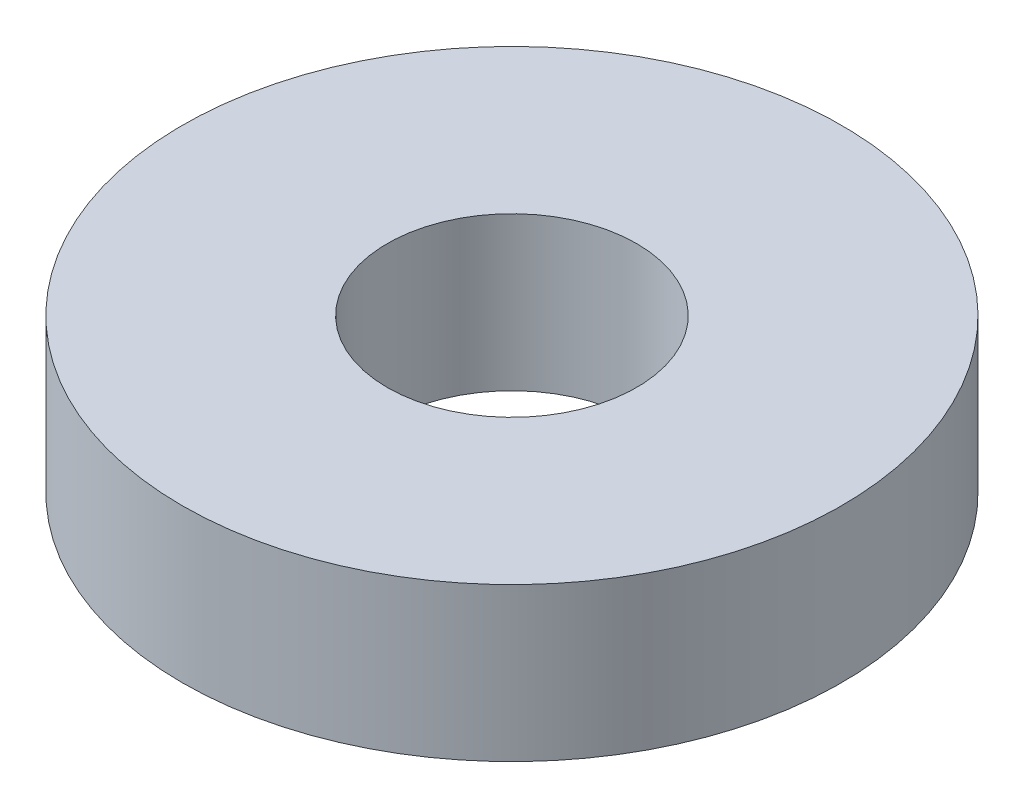
ISO-10303-21;
HEADER;
FILE_DESCRIPTION(('STEP AP214'),'2;1');
FILE_NAME('part.step','',(''),(''),'','','');
FILE_SCHEMA(('AUTOMOTIVE_DESIGN { 1 0 10303 214 1 1 1 1 }'));
ENDSEC;
DATA;
#1=APPLICATION_CONTEXT('core data for automotive mechanical design processes');
#2=APPLICATION_PROTOCOL_DEFINITION('international standard','automotive_design',2000,#1);
#3=PRODUCT_CONTEXT('',#1,'mechanical');
#4=PRODUCT('Part','Part','',(#3));
#5=PRODUCT_RELATED_PRODUCT_CATEGORY('part','',(#4));
#6=PRODUCT_DEFINITION_FORMATION('','',#4);
#7=PRODUCT_DEFINITION_CONTEXT('part definition',#1,'design');
#8=PRODUCT_DEFINITION('design','',#6,#7);
#9=PRODUCT_DEFINITION_SHAPE('','',#8);
#10=(LENGTH_UNIT() NAMED_UNIT(*) SI_UNIT(.MILLI.,.METRE.));
#11=(NAMED_UNIT(*) PLANE_ANGLE_UNIT() SI_UNIT($,.RADIAN.));
#12=(NAMED_UNIT(*) SI_UNIT($,.STERADIAN.) SOLID_ANGLE_UNIT());
#13=UNCERTAINTY_MEASURE_WITH_UNIT(LENGTH_MEASURE(1.E-05),#10,'distance_accuracy_value','');
#14=(GEOMETRIC_REPRESENTATION_CONTEXT(3) GLOBAL_UNCERTAINTY_ASSIGNED_CONTEXT((#13)) GLOBAL_UNIT_ASSIGNED_CONTEXT((#10,
#11,#12)) REPRESENTATION_CONTEXT('',''));
#15=CARTESIAN_POINT('',(0.,0.,0.));
#16=DIRECTION('',(0.,0.,1.));
#17=DIRECTION('',(1.,0.,0.));
#18=AXIS2_PLACEMENT_3D('',#15,#16,#17);
#19=CARTESIAN_POINT('',(0.,15.,0.));
#20=DIRECTION('',(0.,1.,0.));
#21=DIRECTION('',(0.,0.,1.));
#22=AXIS2_PLACEMENT_3D('',#19,#20,#21);
#23=PLANE('',#22);
#24=CARTESIAN_POINT('',(0.,15.,0.));
#25=DIRECTION('',(0.,1.,0.));
#26=DIRECTION('',(0.,0.,1.));
#27=AXIS2_PLACEMENT_3D('',#24,#25,#26);
#28=CIRCLE('',#27,32.2427292201506);
#29=CARTESIAN_POINT('',(0.,15.,32.2427292201506));
#30=VERTEX_POINT('',#29);
#31=EDGE_CURVE('E10',#30,#30,#28,.T.);
#32=ORIENTED_EDGE('',*,*,#31,.T.);
#33=EDGE_LOOP('',(#32));
#34=FACE_BOUND('',#33,.T.);
#35=CARTESIAN_POINT('',(0.,15.,0.));
#36=DIRECTION('',(0.,1.,0.));
#37=DIRECTION('',(0.,0.,1.));
#38=AXIS2_PLACEMENT_3D('',#35,#36,#37);
#39=CIRCLE('',#38,12.2);
#40=CARTESIAN_POINT('',(0.,15.,12.2));
#41=VERTEX_POINT('',#40);
#42=EDGE_CURVE('E48',#41,#41,#39,.T.);
#43=ORIENTED_EDGE('',*,*,#42,.F.);
#44=EDGE_LOOP('',(#43));
#45=FACE_BOUND('',#44,.T.);
#46=ADVANCED_FACE('F37',(#34,#45),#23,.T.);
#47=CARTESIAN_POINT('',(0.,0.,0.));
#48=DIRECTION('',(0.,1.,0.));
#49=DIRECTION('',(0.,0.,1.));
#50=AXIS2_PLACEMENT_3D('',#47,#48,#49);
#51=PLANE('',#50);
#52=CARTESIAN_POINT('',(0.,0.,0.));
#53=DIRECTION('',(0.,1.,0.));
#54=DIRECTION('',(0.,0.,1.));
#55=AXIS2_PLACEMENT_3D('',#52,#53,#54);
#56=CIRCLE('',#55,32.2427292201506);
#57=CARTESIAN_POINT('',(0.,0.,32.2427292201506));
#58=VERTEX_POINT('',#57);
#59=EDGE_CURVE('E41',#58,#58,#56,.T.);
#60=ORIENTED_EDGE('',*,*,#59,.F.);
#61=EDGE_LOOP('',(#60));
#62=FACE_BOUND('',#61,.T.);
#63=CARTESIAN_POINT('',(0.,0.,0.));
#64=DIRECTION('',(0.,1.,0.));
#65=DIRECTION('',(0.,0.,1.));
#66=AXIS2_PLACEMENT_3D('',#63,#64,#65);
#67=CIRCLE('',#66,12.2);
#68=CARTESIAN_POINT('',(0.,0.,12.2));
#69=VERTEX_POINT('',#68);
#70=EDGE_CURVE('E50',#69,#69,#67,.T.);
#71=ORIENTED_EDGE('',*,*,#70,.T.);
#72=EDGE_LOOP('',(#71));
#73=FACE_BOUND('',#72,.T.);
#74=ADVANCED_FACE('F60',(#62,#73),#51,.F.);
#75=CARTESIAN_POINT('',(0.,15.,0.));
#76=DIRECTION('',(0.,-1.,0.));
#77=DIRECTION('',(0.,0.,-1.));
#78=AXIS2_PLACEMENT_3D('',#75,#76,#77);
#79=CYLINDRICAL_SURFACE('',#78,32.2427292201506);
#80=ORIENTED_EDGE('',*,*,#31,.F.);
#81=EDGE_LOOP('',(#80));
#82=FACE_BOUND('',#81,.T.);
#83=ORIENTED_EDGE('',*,*,#59,.T.);
#84=EDGE_LOOP('',(#83));
#85=FACE_BOUND('',#84,.T.);
#86=ADVANCED_FACE('F39',(#82,#85),#79,.T.);
#87=CARTESIAN_POINT('',(0.,15.,0.));
#88=DIRECTION('',(0.,-1.,0.));
#89=DIRECTION('',(0.,0.,-1.));
#90=AXIS2_PLACEMENT_3D('',#87,#88,#89);
#91=CYLINDRICAL_SURFACE('',#90,12.2);
#92=ORIENTED_EDGE('',*,*,#42,.T.);
#93=EDGE_LOOP('',(#92));
#94=FACE_BOUND('',#93,.T.);
#95=ORIENTED_EDGE('',*,*,#70,.F.);
#96=EDGE_LOOP('',(#95));
#97=FACE_BOUND('',#96,.T.);
#98=ADVANCED_FACE('F56',(#94,#97),#91,.F.);
#99=CLOSED_SHELL('',(#46,#74,#86,#98));
#100=MANIFOLD_SOLID_BREP('B2',#99);
#101=ADVANCED_BREP_SHAPE_REPRESENTATION('',(#18,#100),#14);
#102=SHAPE_DEFINITION_REPRESENTATION(#9,#101);
ENDSEC;
END-ISO-10303-21;
